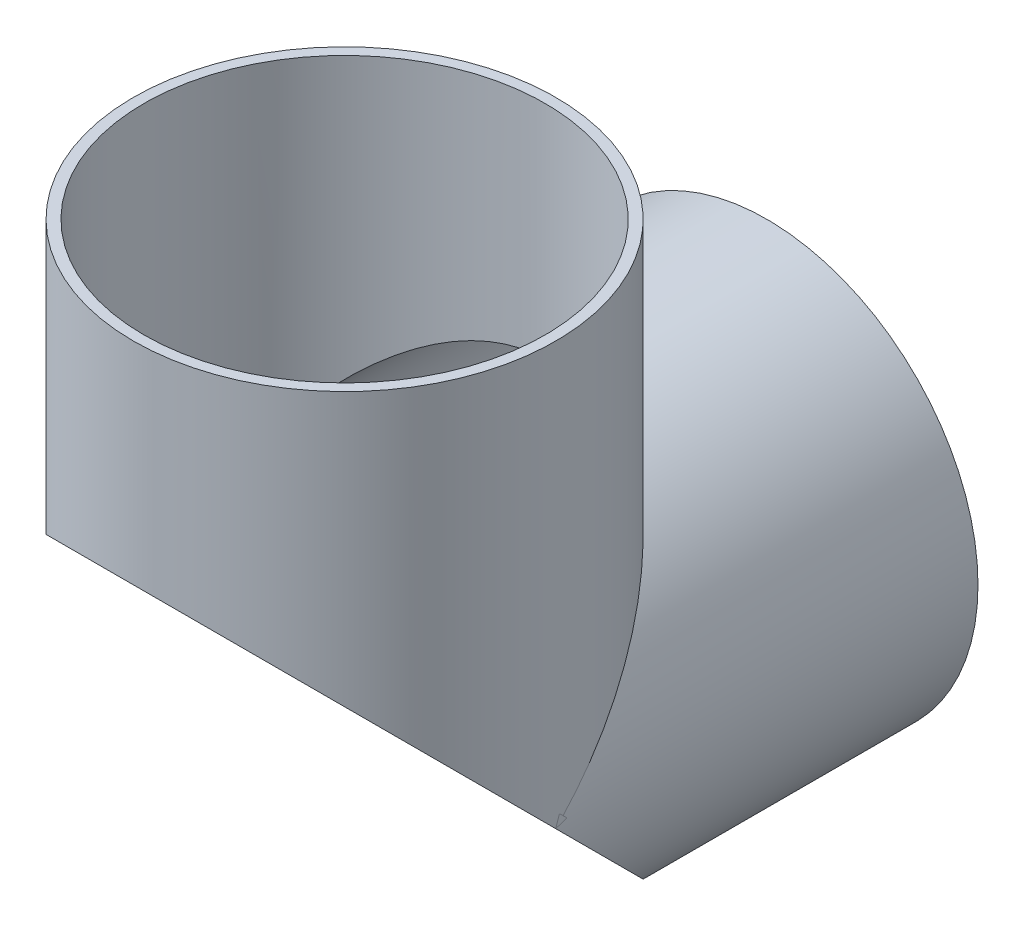
ISO-10303-21;
HEADER;
FILE_DESCRIPTION(('STEP AP214'),'2;1');
FILE_NAME('part.step','',(''),(''),'','','');
FILE_SCHEMA(('AUTOMOTIVE_DESIGN { 1 0 10303 214 1 1 1 1 }'));
ENDSEC;
DATA;
#1=APPLICATION_CONTEXT('core data for automotive mechanical design processes');
#2=APPLICATION_PROTOCOL_DEFINITION('international standard','automotive_design',2000,#1);
#3=PRODUCT_CONTEXT('',#1,'mechanical');
#4=PRODUCT('Part','Part','',(#3));
#5=PRODUCT_RELATED_PRODUCT_CATEGORY('part','',(#4));
#6=PRODUCT_DEFINITION_FORMATION('','',#4);
#7=PRODUCT_DEFINITION_CONTEXT('part definition',#1,'design');
#8=PRODUCT_DEFINITION('design','',#6,#7);
#9=PRODUCT_DEFINITION_SHAPE('','',#8);
#10=(LENGTH_UNIT() NAMED_UNIT(*) SI_UNIT(.MILLI.,.METRE.));
#11=(NAMED_UNIT(*) PLANE_ANGLE_UNIT() SI_UNIT($,.RADIAN.));
#12=(NAMED_UNIT(*) SI_UNIT($,.STERADIAN.) SOLID_ANGLE_UNIT());
#13=UNCERTAINTY_MEASURE_WITH_UNIT(LENGTH_MEASURE(1.E-05),#10,'distance_accuracy_value','');
#14=(GEOMETRIC_REPRESENTATION_CONTEXT(3) GLOBAL_UNCERTAINTY_ASSIGNED_CONTEXT((#13)) GLOBAL_UNIT_ASSIGNED_CONTEXT((#10,
#11,#12)) REPRESENTATION_CONTEXT('',''));
#15=CARTESIAN_POINT('',(0.,0.,0.));
#16=DIRECTION('',(0.,0.,1.));
#17=DIRECTION('',(1.,0.,0.));
#18=AXIS2_PLACEMENT_3D('',#15,#16,#17);
#19=CARTESIAN_POINT('',(0.,-1.11022302462516E-13,200.));
#20=DIRECTION('',(0.,0.707106781186547,-0.707106781186548));
#21=DIRECTION('',(0.,0.707106781186548,0.707106781186547));
#22=AXIS2_PLACEMENT_3D('',#19,#20,#21);
#23=PLANE('',#22);
#24=CARTESIAN_POINT('',(0.,0.,200.));
#25=DIRECTION('',(0.,0.707106781186547,-0.707106781186547));
#26=DIRECTION('',(0.,-0.707106781186547,-0.707106781186547));
#27=AXIS2_PLACEMENT_3D('',#24,#25,#26);
#28=ELLIPSE('',#27,141.42135623731,100.);
#29=CARTESIAN_POINT('',(-100.,1.82567841077825E-12,200.000000000002));
#30=VERTEX_POINT('',#29);
#31=CARTESIAN_POINT('',(100.,0.,200.));
#32=VERTEX_POINT('',#31);
#33=EDGE_CURVE('E62',#30,#32,#28,.T.);
#34=ORIENTED_EDGE('',*,*,#33,.F.);
#35=CARTESIAN_POINT('',(0.,0.,200.));
#36=DIRECTION('',(0.,-0.707106781186547,0.707106781186548));
#37=DIRECTION('',(0.,-0.707106781186548,-0.707106781186547));
#38=AXIS2_PLACEMENT_3D('',#35,#36,#37);
#39=ELLIPSE('',#38,141.421356237309,100.);
#40=EDGE_CURVE('E69',#30,#32,#39,.T.);
#41=ORIENTED_EDGE('',*,*,#40,.T.);
#42=EDGE_LOOP('',(#34,#41));
#43=FACE_BOUND('',#42,.T.);
#44=ADVANCED_FACE('F42',(#43),#23,.F.);
#45=CARTESIAN_POINT('',(0.,0.,300.));
#46=DIRECTION('',(0.,0.,-1.));
#47=DIRECTION('',(-1.,0.,0.));
#48=AXIS2_PLACEMENT_3D('',#45,#46,#47);
#49=CYLINDRICAL_SURFACE('',#48,100.);
#50=CARTESIAN_POINT('',(0.,0.,0.));
#51=DIRECTION('',(0.,0.,1.));
#52=DIRECTION('',(1.,0.,0.));
#53=AXIS2_PLACEMENT_3D('',#50,#51,#52);
#54=CIRCLE('',#53,100.);
#55=CARTESIAN_POINT('',(100.,0.,0.));
#56=VERTEX_POINT('',#55);
#57=EDGE_CURVE('E124',#56,#56,#54,.T.);
#58=ORIENTED_EDGE('',*,*,#57,.T.);
#59=EDGE_LOOP('',(#58));
#60=FACE_BOUND('',#59,.T.);
#61=ORIENTED_EDGE('',*,*,#40,.F.);
#62=CARTESIAN_POINT('',(-100.,-1.7343848482814E-13,199.999999999999));
#63=CARTESIAN_POINT('',(-99.9999999999833,0.0118915391122889,199.964673726303));
#64=CARTESIAN_POINT('',(-99.9999978788551,0.0237830782543081,199.929347452515));
#65=CARTESIAN_POINT('',(-99.9999591831496,0.132251892634134,199.60711842995));
#66=CARTESIAN_POINT('',(-99.9997848229157,0.228829165088495,199.320215689251));
#67=CARTESIAN_POINT('',(-99.9982134662523,0.711715938259225,197.885700765226));
#68=CARTESIAN_POINT('',(-99.9947178022097,1.0980248147733,196.738090436615));
#69=CARTESIAN_POINT('',(-99.9775137564245,2.25695959473605,193.295235238043));
#70=CARTESIAN_POINT('',(-99.957088178979,3.0295766133805,191.000016761998));
#71=CARTESIAN_POINT('',(-99.8982948870235,4.57475501661031,186.409745082534));
#72=CARTESIAN_POINT('',(-99.859926794793,5.347316399682,184.114691883613));
#73=CARTESIAN_POINT('',(-99.7177867687854,7.66563784107617,177.227639078725));
#74=CARTESIAN_POINT('',(-99.5869908028377,9.21123901037178,172.636111485393));
#75=CARTESIAN_POINT('',(-99.2526306804658,12.3016624298027,163.455370239052));
#76=CARTESIAN_POINT('',(-99.049065227961,13.8464846655737,158.866156628713));
#77=CARTESIAN_POINT('',(-98.567979025885,16.9350653342862,149.690889654115));
#78=CARTESIAN_POINT('',(-98.2904532853104,18.4788236883832,145.104836524078));
#79=CARTESIAN_POINT('',(-97.6598238479092,21.564763706029,135.937414149023));
#80=CARTESIAN_POINT('',(-97.3067205184413,23.1069453772051,131.356044881347));
#81=CARTESIAN_POINT('',(-96.5227436929072,26.1894926645148,122.198701312692));
#82=CARTESIAN_POINT('',(-96.091860539231,27.7298580311921,117.622727752775));
#83=CARTESIAN_POINT('',(-95.1496318456839,30.8080919704198,108.478197875732));
#84=CARTESIAN_POINT('',(-94.6382861134725,32.345960536993,103.909641576362));
#85=CARTESIAN_POINT('',(-93.5317409020801,35.4186388713055,94.7816157715021));
#86=CARTESIAN_POINT('',(-92.9365409037274,36.953448620047,90.2221463224501));
#87=CARTESIAN_POINT('',(-91.6581202425339,40.0193457705283,81.1142654251485));
#88=CARTESIAN_POINT('',(-90.974899847349,41.5504331835726,76.5658539433163));
#89=CARTESIAN_POINT('',(-89.7583457133371,44.0989271005332,68.9950262462646));
#90=CARTESIAN_POINT('',(-89.2508694303892,45.1175951853389,65.9688622443715));
#91=CARTESIAN_POINT('',(-88.1926474685648,47.1526508885294,59.9233088372314));
#92=CARTESIAN_POINT('',(-87.6419016398468,48.1690384990043,56.903919455482));
#93=CARTESIAN_POINT('',(-86.4950681501336,50.1992274832938,50.8728236422976));
#94=CARTESIAN_POINT('',(-85.8989797174011,51.2130288127857,47.8611173425318));
#95=CARTESIAN_POINT('',(-84.6590460639588,53.2377243754063,41.8463408733502));
#96=CARTESIAN_POINT('',(-84.0151978987074,54.2486184252939,38.8432712482898));
#97=CARTESIAN_POINT('',(-82.6770322036411,56.2669932479182,32.8472718431298));
#98=CARTESIAN_POINT('',(-81.9827152884284,57.2744740620647,29.8543419400144));
#99=CARTESIAN_POINT('',(-80.5404359496793,59.28549038382,23.8802024819339));
#100=CARTESIAN_POINT('',(-79.792475425055,60.2890260297572,20.8989925160354));
#101=CARTESIAN_POINT('',(-78.290902406526,62.2248621111805,15.1481914940815));
#102=CARTESIAN_POINT('',(-77.5409864886276,63.1574540677576,12.3777344143927));
#103=CARTESIAN_POINT('',(-75.9876137009226,65.0180854234326,6.85034456747156));
#104=CARTESIAN_POINT('',(-75.184157473958,65.9461248770475,4.09341163828551));
#105=CARTESIAN_POINT('',(-73.5200636266441,67.7963688458683,-1.40312032999216));
#106=CARTESIAN_POINT('',(-72.6594612722748,68.718576582044,-4.14272893764015));
#107=CARTESIAN_POINT('',(-70.875763944533,70.5568308736887,-9.60364309276668));
#108=CARTESIAN_POINT('',(-69.9526689491666,71.472877426989,-12.3249486338032));
#109=CARTESIAN_POINT('',(-68.0378887740658,73.2979966459571,-17.7468423418611));
#110=CARTESIAN_POINT('',(-67.0461823990658,74.207067059357,-20.4474238180556));
#111=CARTESIAN_POINT('',(-65.5021425599706,75.5641329892732,-24.4788685315599));
#112=CARTESIAN_POINT('',(-64.9780353380064,76.0154096219416,-25.8194790022763));
#113=CARTESIAN_POINT('',(-63.9099687046666,76.915563087617,-28.493570843022));
#114=CARTESIAN_POINT('',(-63.3660095635358,77.364439953197,-29.8270523098156));
#115=CARTESIAN_POINT('',(-62.2558206694959,78.2606087105864,-32.4893067513586));
#116=CARTESIAN_POINT('',(-61.689541382341,78.7078943608088,-33.8180611841839));
#117=CARTESIAN_POINT('',(-60.5346888164108,79.5995203496951,-36.4668203933577));
#118=CARTESIAN_POINT('',(-59.9461159365613,80.043860740895,-37.7868253257753));
#119=CARTESIAN_POINT('',(-58.7453000987124,80.9292667044664,-40.4171066646974));
#120=CARTESIAN_POINT('',(-58.1330576471057,81.3703323466584,-41.7273832786179));
#121=CARTESIAN_POINT('',(-56.8833661411814,82.2488054672208,-44.3370691750628));
#122=CARTESIAN_POINT('',(-56.2459176402826,82.6862130256522,-45.6364786954248));
#123=CARTESIAN_POINT('',(-54.8630681563,83.6111195255857,-48.3841045383935));
#124=CARTESIAN_POINT('',(-54.1141052652703,84.0980777396284,-49.830714518367));
#125=CARTESIAN_POINT('',(-52.5793142854262,85.0660857956364,-52.7063824383957));
#126=CARTESIAN_POINT('',(-51.793484340614,85.5471353386,-54.1354394902044));
#127=CARTESIAN_POINT('',(-50.1816721199759,86.5024722311601,-56.9734651013605));
#128=CARTESIAN_POINT('',(-49.3556821473427,86.9767582618006,-58.3824297424766));
#129=CARTESIAN_POINT('',(-47.6595881528471,87.9176022219034,-61.1774011035404));
#130=CARTESIAN_POINT('',(-46.7894600773976,88.3841557496624,-62.5633947473187));
#131=CARTESIAN_POINT('',(-45.0049969217877,89.3059612531586,-65.3018084397033));
#132=CARTESIAN_POINT('',(-44.0908572830911,89.7612516592423,-66.6543426535932));
#133=CARTESIAN_POINT('',(-42.2103820280495,90.6607428239989,-69.3264669926283));
#134=CARTESIAN_POINT('',(-41.2440500737347,91.1049443575239,-70.6460594196315));
#135=CARTESIAN_POINT('',(-39.7517112623661,91.7610812885426,-72.595249730565));
#136=CARTESIAN_POINT('',(-39.247291699608,91.9780321372462,-73.2397470485031));
#137=CARTESIAN_POINT('',(-38.2233124846292,92.4082620587223,-74.5178339153913));
#138=CARTESIAN_POINT('',(-37.7037533592084,92.6215412588445,-75.15142384266));
#139=CARTESIAN_POINT('',(-36.6490166480684,93.0439256227826,-76.4062038599957));
#140=CARTESIAN_POINT('',(-36.1138487458066,93.2530332444558,-77.0274012516357));
#141=CARTESIAN_POINT('',(-35.0267816174656,93.6667642932045,-78.2564748084337));
#142=CARTESIAN_POINT('',(-34.4748828089374,93.8713878319695,-78.8643513053882));
#143=CARTESIAN_POINT('',(-33.061603121278,94.3808886226103,-80.3779286664262));
#144=CARTESIAN_POINT('',(-32.1886409382836,94.6825182701136,-81.2739818507684));
#145=CARTESIAN_POINT('',(-30.3988191852552,95.2722390677525,-83.0258693159802));
#146=CARTESIAN_POINT('',(-29.4819610152131,95.5603306490831,-83.8817048778034));
#147=CARTESIAN_POINT('',(-27.5997518264022,96.1208579457224,-85.5468670169431));
#148=CARTESIAN_POINT('',(-26.6343345731337,96.3932711274121,-86.3561266534887));
#149=CARTESIAN_POINT('',(-24.6531453853031,96.9188971380846,-87.9176073120873));
#150=CARTESIAN_POINT('',(-23.6373726128803,97.1721096474119,-88.6698273845376));
#151=CARTESIAN_POINT('',(-21.5394410207843,97.6587290610163,-90.1154308878149));
#152=CARTESIAN_POINT('',(-20.4565841395181,97.8918312447749,-90.8079090833865));
#153=CARTESIAN_POINT('',(-18.2353509107448,98.3298142530036,-92.1090280962546));
#154=CARTESIAN_POINT('',(-17.0969692349153,98.5346923617654,-92.7176608459782));
#155=CARTESIAN_POINT('',(-15.3510101216336,98.8164616865762,-93.5547148386363));
#156=CARTESIAN_POINT('',(-14.7633492696309,98.9060352014636,-93.8208114704226));
#157=CARTESIAN_POINT('',(-13.5752789488783,99.0760906350332,-94.3259962691521));
#158=CARTESIAN_POINT('',(-12.9748714538615,99.1565739492498,-94.5650885818184));
#159=CARTESIAN_POINT('',(-11.7622217137345,99.3077206269972,-95.0141010148445));
#160=CARTESIAN_POINT('',(-11.1499830826764,99.378386936954,-95.2240298881716));
#161=CARTESIAN_POINT('',(-9.91467077354451,99.5092204144234,-95.6126977630818));
#162=CARTESIAN_POINT('',(-9.29159914962308,99.5693895490413,-95.7914426083579));
#163=CARTESIAN_POINT('',(-8.07179074522208,99.6754698231141,-96.1065759785877));
#164=CARTESIAN_POINT('',(-7.47558258422537,99.721999061381,-96.2448006937611));
#165=CARTESIAN_POINT('',(-6.27618075653445,99.8046633299756,-96.4903719819905));
#166=CARTESIAN_POINT('',(-5.67298794827883,99.8407996238208,-96.5977223085859));
#167=CARTESIAN_POINT('',(-4.46125151650037,99.9022783300207,-96.780357506802));
#168=CARTESIAN_POINT('',(-3.85270827445823,99.9276215056456,-96.8556446458748));
#169=CARTESIAN_POINT('',(-2.6323738184983,99.9672101192839,-96.9732508016618));
#170=CARTESIAN_POINT('',(-2.02058433578164,99.9814609706178,-97.0155858997632));
#171=CARTESIAN_POINT('',(-0.79540160632904,99.9987136047095,-97.0668384137126));
#172=CARTESIAN_POINT('',(-0.182008238592547,100.00171451272,-97.0757532309423));
#173=CARTESIAN_POINT('',(1.04430096744678,99.9964266067743,-97.0600444138542));
#174=CARTESIAN_POINT('',(1.6572168181473,99.9881380964081,-97.0354216814119));
#175=CARTESIAN_POINT('',(2.72714911508751,99.9638580888564,-96.9632929027503));
#176=CARTESIAN_POINT('',(3.18472933121801,99.95031852245,-96.9230708234769));
#177=CARTESIAN_POINT('',(4.09771071165408,99.9170526690965,-96.8242477333928));
#178=CARTESIAN_POINT('',(4.55311173327161,99.8973259825113,-96.7656455353745));
#179=CARTESIAN_POINT('',(5.46087907403801,99.8518166642512,-96.6304507032954));
#180=CARTESIAN_POINT('',(5.91324571630685,99.8260346882599,-96.5538600170785));
#181=CARTESIAN_POINT('',(6.81430118816465,99.7685783397866,-96.3831740635049));
#182=CARTESIAN_POINT('',(7.26298967621535,99.7369034264389,-96.2890771893948));
#183=CARTESIAN_POINT('',(8.60305725903937,99.6332770899068,-95.9812337476114));
#184=CARTESIAN_POINT('',(9.48804441943277,99.5527440733559,-95.741993783893));
#185=CARTESIAN_POINT('',(11.236373158162,99.3706042702267,-95.200909868766));
#186=CARTESIAN_POINT('',(12.099711794853,99.2689946369226,-94.8990574605706));
#187=CARTESIAN_POINT('',(13.5560987463693,99.0787822753626,-94.3339923428412));
#188=CARTESIAN_POINT('',(14.1552500732229,98.9948878826974,-94.0847667169174));
#189=CARTESIAN_POINT('',(15.3404808600124,98.8181598586597,-93.5597596096509));
#190=CARTESIAN_POINT('',(15.9265590836274,98.7253253862028,-93.2839756296932));
#191=CARTESIAN_POINT('',(17.6647529966837,98.4344290057773,-92.4198078326893));
#192=CARTESIAN_POINT('',(18.7966974251003,98.2239914552804,-91.7946596127157));
#193=CARTESIAN_POINT('',(21.007413748382,97.7750716665202,-90.4610506337492));
#194=CARTESIAN_POINT('',(22.0860612887382,97.5365278649253,-89.7524069881607));
#195=CARTESIAN_POINT('',(24.1891105660362,97.0363594288065,-88.2665533142876));
#196=CARTESIAN_POINT('',(25.2135144808518,96.7747357220637,-87.4893460421682));
#197=CARTESIAN_POINT('',(27.0991425857278,96.2625645091294,-85.967835640001));
#198=CARTESIAN_POINT('',(27.9658135474911,96.014043340747,-85.2295521650547));
#199=CARTESIAN_POINT('',(29.6611299804209,95.5039333083676,-83.7141649255641));
#200=CARTESIAN_POINT('',(30.4897584386076,95.242338704947,-82.937044110876));
#201=CARTESIAN_POINT('',(32.1113885777001,94.7079084452835,-81.3494086116991));
#202=CARTESIAN_POINT('',(32.9043710433106,94.4350668746323,-80.5388763572385));
#203=CARTESIAN_POINT('',(34.4566441198024,93.8798120813163,-78.8893772785156));
#204=CARTESIAN_POINT('',(35.2159340462224,93.5973986644056,-78.0504098772057));
#205=CARTESIAN_POINT('',(36.7045448927417,93.0237274481581,-76.3462010093472));
#206=CARTESIAN_POINT('',(37.4338040007386,92.7324533621334,-75.4809111598273));
#207=CARTESIAN_POINT('',(38.862611769474,92.1427936039175,-73.729205024832));
#208=CARTESIAN_POINT('',(39.5621729483074,91.8444110125493,-72.8427978915781));
#209=CARTESIAN_POINT('',(40.9338205289572,91.2413476747953,-71.0512736543963));
#210=CARTESIAN_POINT('',(41.605909958129,90.9366676279837,-70.1461586286981));
#211=CARTESIAN_POINT('',(42.9244909503339,90.3217427210469,-68.3193971496701));
#212=CARTESIAN_POINT('',(43.5709831698444,90.0114980039325,-67.3977511211838));
#213=CARTESIAN_POINT('',(44.928830287693,89.3423222366358,-65.4098262532674));
#214=CARTESIAN_POINT('',(45.6366055503406,88.9826523348968,-64.3413525026406));
#215=CARTESIAN_POINT('',(47.0233274343185,88.257683986387,-62.1876842455355));
#216=CARTESIAN_POINT('',(47.7022724513556,87.8923852279293,-61.1024888131268));
#217=CARTESIAN_POINT('',(49.0333316567463,87.1568161351158,-58.9173288549676));
#218=CARTESIAN_POINT('',(49.6854438309338,86.7865454303053,-57.8173632287049));
#219=CARTESIAN_POINT('',(50.9645546642266,86.0416287859581,-55.6044344375119));
#220=CARTESIAN_POINT('',(51.5915537263416,85.6669829167577,-54.4914714815302));
#221=CARTESIAN_POINT('',(52.8211569552892,84.9143344930754,-52.2555738424454));
#222=CARTESIAN_POINT('',(53.4237952045227,84.5363375990049,-51.1326559747635));
#223=CARTESIAN_POINT('',(54.6070723108799,83.7768575577342,-48.8764636042249));
#224=CARTESIAN_POINT('',(55.1877110863398,83.3953743975992,-47.7431890629427));
#225=CARTESIAN_POINT('',(56.3282559045404,82.6292897523018,-45.4673763516373));
#226=CARTESIAN_POINT('',(56.8881628735674,82.2446884073965,-44.3248385982766));
#227=CARTESIAN_POINT('',(57.9884383387714,81.4726487743931,-42.0313353656945));
#228=CARTESIAN_POINT('',(58.5288064790338,81.0852104347714,-40.8803697334118));
#229=CARTESIAN_POINT('',(60.1111371380059,79.9271506502145,-37.4401138892011));
#230=CARTESIAN_POINT('',(61.1261853080631,79.1527730928287,-35.1396653692272));
#231=CARTESIAN_POINT('',(63.0912130955687,77.5955536403196,-30.5136232653064));
#232=CARTESIAN_POINT('',(64.0411819640062,76.8127103715375,-28.1880256006224));
#233=CARTESIAN_POINT('',(65.8819662053753,75.239831763617,-23.5154647403848));
#234=CARTESIAN_POINT('',(66.7727710931513,74.4497951777253,-21.1684978410929));
#235=CARTESIAN_POINT('',(68.5000391347191,72.8637032297543,-16.4566840243698));
#236=CARTESIAN_POINT('',(69.3365016846909,72.0676478009068,-14.0918369085901));
#237=CARTESIAN_POINT('',(70.9603464474314,70.469345313156,-9.34374916076365));
#238=CARTESIAN_POINT('',(71.7476646830302,69.6670916507647,-6.96048891169191));
#239=CARTESIAN_POINT('',(73.2755890455757,68.0581997013367,-2.18094298017972));
#240=CARTESIAN_POINT('',(74.0162016763289,67.2515620418436,0.215340838012712));
#241=CARTESIAN_POINT('',(75.4539361215785,65.6343962332274,5.01946597761637));
#242=CARTESIAN_POINT('',(76.1510598637319,64.823868258261,7.42730678165876));
#243=CARTESIAN_POINT('',(77.5045601560665,63.1993735235859,12.2532040102688));
#244=CARTESIAN_POINT('',(78.1609372556731,62.3854068104031,14.6712602966217));
#245=CARTESIAN_POINT('',(79.432817333866,60.7576341273005,19.5068953482627));
#246=CARTESIAN_POINT('',(80.048470943309,59.9438401205751,21.9244385744099));
#247=CARTESIAN_POINT('',(81.2437733822365,58.3135567746308,26.7675320687179));
#248=CARTESIAN_POINT('',(81.8234217211758,57.497067398849,29.1930824454964));
#249=CARTESIAN_POINT('',(82.9485169860533,55.8616914804753,34.0513044783258));
#250=CARTESIAN_POINT('',(83.4939637126773,55.0428049239426,36.4839761757907));
#251=CARTESIAN_POINT('',(84.5522579108257,53.4028837781222,41.3557007457936));
#252=CARTESIAN_POINT('',(85.065105035504,52.5818491660767,43.794753685938));
#253=CARTESIAN_POINT('',(86.0592687612502,50.9384323885171,48.6768627522149));
#254=CARTESIAN_POINT('',(86.5406070064603,50.1160515543684,51.1199149232512));
#255=CARTESIAN_POINT('',(87.473406510755,48.4695614915038,56.0111538184662));
#256=CARTESIAN_POINT('',(87.9248675094335,47.6454522477879,58.4593405872056));
#257=CARTESIAN_POINT('',(88.7990260564082,45.9957002596873,63.3602697052443));
#258=CARTESIAN_POINT('',(89.2217241849448,45.170057546583,65.8130119616186));
#259=CARTESIAN_POINT('',(90.0393693965351,43.5173729493425,70.7226530009828));
#260=CARTESIAN_POINT('',(90.4343162914783,42.6903310557609,73.1795518120322));
#261=CARTESIAN_POINT('',(91.5471783264006,40.2761385040233,80.3514095571373));
#262=CARTESIAN_POINT('',(92.2292159436746,38.6872920465886,85.0714062133022));
#263=CARTESIAN_POINT('',(93.5001024415841,35.5058362885166,94.522577828765));
#264=CARTESIAN_POINT('',(94.0889514815496,33.9132269943175,99.2537527689366));
#265=CARTESIAN_POINT('',(95.1779177264776,30.7246273967314,108.726146635586));
#266=CARTESIAN_POINT('',(95.6780183924014,29.1286365191186,113.46736726792));
#267=CARTESIAN_POINT('',(96.5928506126748,25.9341724541942,122.957182746394));
#268=CARTESIAN_POINT('',(97.007581976793,24.3356992613593,127.705777608943));
#269=CARTESIAN_POINT('',(97.8219059218379,20.847913053503,138.066967113097));
#270=CARTESIAN_POINT('',(98.2052364432343,18.9582124249861,143.680713240668));
#271=CARTESIAN_POINT('',(98.8602335972496,15.1768211580159,154.914117231525));
#272=CARTESIAN_POINT('',(99.1318984435192,13.2851304882125,160.533775187943));
#273=CARTESIAN_POINT('',(99.5658697574477,9.50076234122323,171.776022615743));
#274=CARTESIAN_POINT('',(99.7281924170401,7.60808505170229,177.398611529628));
#275=CARTESIAN_POINT('',(99.9449147987892,3.8221491886573,188.645516182514));
#276=CARTESIAN_POINT('',(99.9993184650482,1.92889063890586,194.269831850893));
#277=CARTESIAN_POINT('',(99.9999978774503,0.023783076521767,199.929347457641));
#278=CARTESIAN_POINT('',(99.9999999985621,0.0118915373764817,199.964673731448));
#279=CARTESIAN_POINT('',(100.,1.7343848482814E-13,200.));
#280=B_SPLINE_CURVE_WITH_KNOTS('',3,(#62,#63,#64,#65,#66,#67,#68,#69,#70,#71,#72,#73,#74,#75,
#76,#77,#78,#79,#80,#81,#82,#83,#84,#85,#86,#87,#88,#89,#90,#91,#92,#93,#94,#95,#96,#97,#98,#99,
#100,#101,#102,#103,#104,#105,#106,#107,#108,#109,#110,#111,#112,#113,#114,#115,#116,#117,#118,
#119,#120,#121,#122,#123,#124,#125,#126,#127,#128,#129,#130,#131,#132,#133,#134,#135,#136,#137,
#138,#139,#140,#141,#142,#143,#144,#145,#146,#147,#148,#149,#150,#151,#152,#153,#154,#155,#156,
#157,#158,#159,#160,#161,#162,#163,#164,#165,#166,#167,#168,#169,#170,#171,#172,#173,#174,#175,
#176,#177,#178,#179,#180,#181,#182,#183,#184,#185,#186,#187,#188,#189,#190,#191,#192,#193,#194,
#195,#196,#197,#198,#199,#200,#201,#202,#203,#204,#205,#206,#207,#208,#209,#210,#211,#212,#213,
#214,#215,#216,#217,#218,#219,#220,#221,#222,#223,#224,#225,#226,#227,#228,#229,#230,#231,#232,
#233,#234,#235,#236,#237,#238,#239,#240,#241,#242,#243,#244,#245,#246,#247,#248,#249,#250,#251,
#252,#253,#254,#255,#256,#257,#258,#259,#260,#261,#262,#263,#264,#265,#266,#267,#268,#269,#270,
#271,#272,#273,#274,#275,#276,#277,#278,#279),.UNSPECIFIED.,.F.,.F.,(4,2,2,2,2,2,2,2,2,2,2,2,2,
2,2,2,2,2,2,2,2,2,2,2,2,2,2,2,2,2,2,2,2,2,2,2,2,2,2,2,2,2,2,2,2,2,2,2,2,2,2,2,2,2,2,2,2,2,2,2,2,
2,2,2,2,2,2,2,2,2,2,2,2,2,2,2,2,2,2,2,2,2,2,2,2,2,2,2,2,2,2,2,2,2,2,2,2,2,2,2,2,2,2,2,2,2,2,2,
4),(0.,0.111822130616854,1.01998688548926,4.65265172542728,11.9181415927663,19.1837844179349,
33.7225563083776,48.2615871584188,62.8015993828741,77.3415409345254,91.8832890960026,
106.425072019078,120.966944979448,135.508773721338,145.207788162096,154.906836191826,
164.606049337645,174.30586096904,184.005554497106,193.704904838288,202.758045302294,
211.811077087602,220.858573080967,229.90607225854,238.956378956604,243.481760012736,
248.007079487655,252.543079919305,257.078999221215,261.614821534183,266.150544314796,
271.250746916695,276.351206554157,281.452647595372,286.556899237463,291.640266611594,
296.72327777768,299.263171920048,301.802977788961,304.341240179366,306.879439274755,
310.738613452278,314.597664629536,318.462130373659,322.326660439837,326.242080713398,
330.157877464272,332.111124662146,334.064071587301,336.016431092585,337.968424343933,
339.808920896779,341.649193597436,343.489336135631,345.328580076044,347.167967025241,
349.00730451151,350.385542572975,351.763869675847,353.142047598359,354.520352075293,
357.278154514221,360.036329680194,361.998551932157,363.960958971049,367.886195485981,
371.820195438811,375.754037322152,379.248527269142,382.744565059363,386.242465358572,
389.740436684842,393.245280592314,396.748632184832,400.251596665419,403.754471249158,
407.747421301591,411.74059325607,415.734064407114,419.727471446131,423.715083079988,
427.70270951475,431.690157568938,435.677678220957,443.569442061519,451.462506241018,
459.356965532573,467.251512527686,475.156131230846,483.05964676554,490.962811725421,
498.865870096319,506.737839962333,514.609917054582,522.482040018051,530.354246723604,
538.220987827808,546.087797488417,553.954448402875,561.821152635953,576.900309356266,
591.979440294564,607.061378416976,622.143350146597,639.949214465181,657.755363618451,
675.558875368788,693.361736444373,693.47355857499),.UNSPECIFIED.);
#281=CARTESIAN_POINT('',(-99.9841423492317,1.78080843754961,194.709740625685));
#282=VERTEX_POINT('',#281);
#283=EDGE_CURVE('E179',#30,#282,#280,.T.);
#284=ORIENTED_EDGE('',*,*,#283,.T.);
#285=CARTESIAN_POINT('',(0.,0.,192.928932188135));
#286=DIRECTION('',(0.,0.707106781186547,-0.707106781186548));
#287=DIRECTION('',(0.,-0.707106781186548,-0.707106781186547));
#288=AXIS2_PLACEMENT_3D('',#285,#286,#287);
#289=ELLIPSE('',#288,141.421356237309,100.);
#290=CARTESIAN_POINT('',(-99.9374804565334,3.53553390593255,196.464466094067));
#291=VERTEX_POINT('',#290);
#292=EDGE_CURVE('E178',#291,#282,#289,.F.);
#293=ORIENTED_EDGE('',*,*,#292,.F.);
#294=CARTESIAN_POINT('',(0.,0.,200.));
#295=DIRECTION('',(0.,-0.707106781186547,-0.707106781186547));
#296=DIRECTION('',(0.,0.707106781186547,-0.707106781186547));
#297=AXIS2_PLACEMENT_3D('',#294,#295,#296);
#298=ELLIPSE('',#297,141.42135623731,100.);
#299=CARTESIAN_POINT('',(99.9374804565334,3.53553390593273,196.464466094067));
#300=VERTEX_POINT('',#299);
#301=EDGE_CURVE('E218',#300,#291,#298,.F.);
#302=ORIENTED_EDGE('',*,*,#301,.F.);
#303=CARTESIAN_POINT('',(99.9841423492317,1.7808084375498,194.709740625684));
#304=VERTEX_POINT('',#303);
#305=EDGE_CURVE('E152',#304,#300,#289,.F.);
#306=ORIENTED_EDGE('',*,*,#305,.F.);
#307=EDGE_CURVE('E173',#304,#32,#280,.T.);
#308=ORIENTED_EDGE('',*,*,#307,.T.);
#309=EDGE_LOOP('',(#61,#284,#293,#302,#306,#308));
#310=FACE_BOUND('',#309,.T.);
#311=ADVANCED_FACE('F160',(#60,#310),#49,.T.);
#312=CARTESIAN_POINT('',(0.,200.,200.));
#313=DIRECTION('',(0.,-1.,0.));
#314=DIRECTION('',(0.,0.,-1.));
#315=AXIS2_PLACEMENT_3D('',#312,#313,#314);
#316=CYLINDRICAL_SURFACE('',#315,100.);
#317=CARTESIAN_POINT('',(0.,200.,200.));
#318=DIRECTION('',(0.,1.,0.));
#319=DIRECTION('',(0.,0.,1.));
#320=AXIS2_PLACEMENT_3D('',#317,#318,#319);
#321=CIRCLE('',#320,100.);
#322=CARTESIAN_POINT('',(0.,200.,300.));
#323=VERTEX_POINT('',#322);
#324=EDGE_CURVE('E190',#323,#323,#321,.T.);
#325=ORIENTED_EDGE('',*,*,#324,.F.);
#326=EDGE_LOOP('',(#325));
#327=FACE_BOUND('',#326,.T.);
#328=ORIENTED_EDGE('',*,*,#33,.T.);
#329=CARTESIAN_POINT('',(100.,1.31731358492581E-13,200.));
#330=CARTESIAN_POINT('',(99.9999999999833,0.0353262736967522,199.988108460887));
#331=CARTESIAN_POINT('',(99.9999978788551,0.0706525474845111,199.976216921745));
#332=CARTESIAN_POINT('',(99.9999591831496,0.392881570050049,199.867748107366));
#333=CARTESIAN_POINT('',(99.9997848229157,0.679784310749004,199.771170834911));
#334=CARTESIAN_POINT('',(99.9982134662523,2.1142992347732,199.28828406174));
#335=CARTESIAN_POINT('',(99.9947178022097,3.26190956338444,198.901975185226));
#336=CARTESIAN_POINT('',(99.9775137564245,6.70476476195682,197.743040405265));
#337=CARTESIAN_POINT('',(99.957088178979,8.99998323800203,196.97042338662));
#338=CARTESIAN_POINT('',(99.8982948870235,13.5902549174648,195.42524498339));
#339=CARTESIAN_POINT('',(99.859926794793,15.8853081163856,194.652683600318));
#340=CARTESIAN_POINT('',(99.7177867687854,22.7723609212743,192.334362158924));
#341=CARTESIAN_POINT('',(99.5869908028377,27.3638885146054,190.788760989628));
#342=CARTESIAN_POINT('',(99.2526306804658,36.5446297609466,187.698337570198));
#343=CARTESIAN_POINT('',(99.049065227961,41.133843371285,186.153515334427));
#344=CARTESIAN_POINT('',(98.567979025885,50.3091103458834,183.064934665714));
#345=CARTESIAN_POINT('',(98.2904532853105,54.89516347592,181.521176311617));
#346=CARTESIAN_POINT('',(97.6598238479092,64.0625858509747,178.435236293971));
#347=CARTESIAN_POINT('',(97.3067205184413,68.6439551186509,176.893054622795));
#348=CARTESIAN_POINT('',(96.5227436929073,77.8012986873054,173.810507335486));
#349=CARTESIAN_POINT('',(96.0918605392312,82.3772722472217,172.270141968808));
#350=CARTESIAN_POINT('',(95.1496318456841,91.5218021242649,169.191908029581));
#351=CARTESIAN_POINT('',(94.6382861134728,96.090358423635,167.654039463008));
#352=CARTESIAN_POINT('',(93.5317409020804,105.218384228494,164.581361128695));
#353=CARTESIAN_POINT('',(92.9365409037278,109.777853677546,163.046551379954));
#354=CARTESIAN_POINT('',(91.6581202425343,118.885734574847,159.980654229473));
#355=CARTESIAN_POINT('',(90.9748998473493,123.434146056679,158.449566816428));
#356=CARTESIAN_POINT('',(89.7583457133376,131.004973753731,155.901072899468));
#357=CARTESIAN_POINT('',(89.2508694303897,134.031137755624,154.882404814662));
#358=CARTESIAN_POINT('',(88.1926474685654,140.076691162764,152.847349111472));
#359=CARTESIAN_POINT('',(87.6419016398473,143.096080544513,151.830961500997));
#360=CARTESIAN_POINT('',(86.4950681501343,149.127176357697,149.800772516707));
#361=CARTESIAN_POINT('',(85.8989797174019,152.138882657463,148.786971187215));
#362=CARTESIAN_POINT('',(84.6590460639596,158.153659126644,146.762275624595));
#363=CARTESIAN_POINT('',(84.0151978987083,161.156728751705,145.751381574707));
#364=CARTESIAN_POINT('',(82.677032203642,167.152728156865,143.733006752083));
#365=CARTESIAN_POINT('',(81.9827152884294,170.14565805998,142.725525937937));
#366=CARTESIAN_POINT('',(80.5404359496804,176.11979751806,140.714509616181));
#367=CARTESIAN_POINT('',(79.7924754250561,179.101007483959,139.710973970244));
#368=CARTESIAN_POINT('',(78.2909024065271,184.851808505913,137.775137888821));
#369=CARTESIAN_POINT('',(77.5409864886286,187.622265585602,136.842545932244));
#370=CARTESIAN_POINT('',(75.9876137009234,193.149655432524,134.981914576568));
#371=CARTESIAN_POINT('',(75.1841574739586,195.906588361711,134.053875122953));
#372=CARTESIAN_POINT('',(73.5200636266444,201.40312032999,132.203631154132));
#373=CARTESIAN_POINT('',(72.659461272275,204.142728937638,131.281423417956));
#374=CARTESIAN_POINT('',(70.8757639445328,209.603643092766,129.443169126311));
#375=CARTESIAN_POINT('',(69.9526689491663,212.324948633803,128.527122573011));
#376=CARTESIAN_POINT('',(68.0378887740652,217.746842341862,126.702003354042));
#377=CARTESIAN_POINT('',(67.046182399065,220.447423818057,125.792932940642));
#378=CARTESIAN_POINT('',(65.5021425599694,224.478868531562,124.435867010726));
#379=CARTESIAN_POINT('',(64.9780353380051,225.819479002278,123.984590378057));
#380=CARTESIAN_POINT('',(63.909968704665,228.493570843024,123.084436912382));
#381=CARTESIAN_POINT('',(63.3660095635341,229.827052309818,122.635560046802));
#382=CARTESIAN_POINT('',(62.255820669494,232.489306751362,121.739391289412));
#383=CARTESIAN_POINT('',(61.689541382339,233.818061184187,121.29210563919));
#384=CARTESIAN_POINT('',(60.5346888164086,236.466820393361,120.400479650303));
#385=CARTESIAN_POINT('',(59.9461159365589,237.786825325779,119.956139259103));
#386=CARTESIAN_POINT('',(58.7453000987097,240.417106664702,119.070733295532));
#387=CARTESIAN_POINT('',(58.1330576471029,241.727383278623,118.62966765334));
#388=CARTESIAN_POINT('',(56.8833661411783,244.337069175068,117.751194532777));
#389=CARTESIAN_POINT('',(56.2459176402794,245.63647869543,117.313786974346));
#390=CARTESIAN_POINT('',(54.8630681562965,248.384104538399,116.388880474412));
#391=CARTESIAN_POINT('',(54.1141052652667,249.830714518373,115.901922260369));
#392=CARTESIAN_POINT('',(52.5793142854224,252.706382438401,114.933914204361));
#393=CARTESIAN_POINT('',(51.7934843406101,254.13543949021,114.452864661398));
#394=CARTESIAN_POINT('',(50.1816721199718,256.973465101366,113.497527768837));
#395=CARTESIAN_POINT('',(49.3556821473384,258.382429742483,113.023241738197));
#396=CARTESIAN_POINT('',(47.6595881528426,261.177401103546,112.082397778094));
#397=CARTESIAN_POINT('',(46.7894600773929,262.563394747325,111.615844250335));
#398=CARTESIAN_POINT('',(45.0049969217828,265.301808439709,110.694038746839));
#399=CARTESIAN_POINT('',(44.0908572830861,266.654342653599,110.238748340755));
#400=CARTESIAN_POINT('',(42.2103820280442,269.326466992634,109.339257175999));
#401=CARTESIAN_POINT('',(41.2440500737292,270.646059419638,108.895055642474));
#402=CARTESIAN_POINT('',(39.7517112623604,272.595249730571,108.238918711455));
#403=CARTESIAN_POINT('',(39.2472916996022,273.239747048509,108.021967862751));
#404=CARTESIAN_POINT('',(38.2233124846233,274.517833915397,107.591737941275));
#405=CARTESIAN_POINT('',(37.7037533592023,275.151423842666,107.378458741153));
#406=CARTESIAN_POINT('',(36.6490166480622,276.406203860002,106.956074377215));
#407=CARTESIAN_POINT('',(36.1138487458003,277.027401251642,106.746966755542));
#408=CARTESIAN_POINT('',(35.0267816174591,278.25647480844,106.333235706793));
#409=CARTESIAN_POINT('',(34.4748828089308,278.864351305394,106.128612168028));
#410=CARTESIAN_POINT('',(33.0616031212714,280.377928666432,105.619111377388));
#411=CARTESIAN_POINT('',(32.1886409382771,281.273981850774,105.317481729884));
#412=CARTESIAN_POINT('',(30.3988191852489,283.025869315985,104.727760932245));
#413=CARTESIAN_POINT('',(29.4819610152069,283.881704877808,104.439669350915));
#414=CARTESIAN_POINT('',(27.5997518263962,285.546867016947,103.879142054276));
#415=CARTESIAN_POINT('',(26.6343345731279,286.356126653492,103.606728872586));
#416=CARTESIAN_POINT('',(24.6531453852974,287.917607312091,103.081102861914));
#417=CARTESIAN_POINT('',(23.6373726128748,288.669827384541,102.827890352587));
#418=CARTESIAN_POINT('',(21.539441020779,290.115430887817,102.341270938983));
#419=CARTESIAN_POINT('',(20.456584139513,290.807909083389,102.108168755224));
#420=CARTESIAN_POINT('',(18.23535091074,292.109028096256,101.670185746996));
#421=CARTESIAN_POINT('',(17.0969692349107,292.71766084598,101.465307638234));
#422=CARTESIAN_POINT('',(15.3510101216293,293.554714838637,101.183538313423));
#423=CARTESIAN_POINT('',(14.7633492696267,293.820811470424,101.093964798536));
#424=CARTESIAN_POINT('',(13.5752789488742,294.325996269153,100.923909364966));
#425=CARTESIAN_POINT('',(12.9748714538576,294.565088581819,100.84342605075));
#426=CARTESIAN_POINT('',(11.7622217137308,295.014101014845,100.692279373002));
#427=CARTESIAN_POINT('',(11.1499830826729,295.224029888172,100.621613063046));
#428=CARTESIAN_POINT('',(9.91467077354116,295.612697763082,100.490779585576));
#429=CARTESIAN_POINT('',(9.29159914961982,295.791442608358,100.430610450958));
#430=CARTESIAN_POINT('',(8.07179074521893,296.106575978588,100.324530176886));
#431=CARTESIAN_POINT('',(7.47558258422222,296.244800693761,100.278000938619));
#432=CARTESIAN_POINT('',(6.2761807565313,296.49037198199,100.195336670024));
#433=CARTESIAN_POINT('',(5.67298794827566,296.597722308586,100.159200376179));
#434=CARTESIAN_POINT('',(4.46125151649718,296.780357506802,100.097721669979));
#435=CARTESIAN_POINT('',(3.85270827445503,296.855644645874,100.072378494354));
#436=CARTESIAN_POINT('',(2.6323738184951,296.973250801661,100.032789880716));
#437=CARTESIAN_POINT('',(2.02058433577844,297.015585899763,100.018539029382));
#438=CARTESIAN_POINT('',(0.795401606325841,297.066838413712,100.00128639529));
#439=CARTESIAN_POINT('',(0.182008238589351,297.075753230942,99.9982854872801));
#440=CARTESIAN_POINT('',(-1.04430096744997,297.060044413853,100.003573393226));
#441=CARTESIAN_POINT('',(-1.65721681815048,297.035421681411,100.011861903592));
#442=CARTESIAN_POINT('',(-2.72714911509067,296.963292902749,100.036141911144));
#443=CARTESIAN_POINT('',(-3.18472933122117,296.923070823476,100.04968147755));
#444=CARTESIAN_POINT('',(-4.09771071165722,296.824247733392,100.082947330904));
#445=CARTESIAN_POINT('',(-4.55311173327473,296.765645535373,100.102674017489));
#446=CARTESIAN_POINT('',(-5.46087907404112,296.630450703294,100.148183335749));
#447=CARTESIAN_POINT('',(-5.91324571630996,296.553860017077,100.17396531174));
#448=CARTESIAN_POINT('',(-6.81430118816772,296.383174063504,100.231421660214));
#449=CARTESIAN_POINT('',(-7.26298967621839,296.289077189394,100.263096573561));
#450=CARTESIAN_POINT('',(-8.60305725904236,295.98123374761,100.366722910093));
#451=CARTESIAN_POINT('',(-9.48804441943575,295.741993783892,100.447255926644));
#452=CARTESIAN_POINT('',(-11.2363731581649,295.200909868765,100.629395729774));
#453=CARTESIAN_POINT('',(-12.0997117948559,294.899057460569,100.731005363078));
#454=CARTESIAN_POINT('',(-13.5560987463722,294.333992342839,100.921217724638));
#455=CARTESIAN_POINT('',(-14.1552500732258,294.084766716916,101.005112117303));
#456=CARTESIAN_POINT('',(-15.3404808600154,293.559759609649,101.181840141341));
#457=CARTESIAN_POINT('',(-15.9265590836304,293.283975629691,101.274674613798));
#458=CARTESIAN_POINT('',(-17.6647529966869,292.419807832687,101.565570994223));
#459=CARTESIAN_POINT('',(-18.7966974251035,291.794659612713,101.77600854472));
#460=CARTESIAN_POINT('',(-21.0074137483853,290.461050633747,102.22492833348));
#461=CARTESIAN_POINT('',(-22.0860612887416,289.752406988158,102.463472135075));
#462=CARTESIAN_POINT('',(-24.1891105660396,288.266553314285,102.963640571194));
#463=CARTESIAN_POINT('',(-25.2135144808552,287.489346042165,103.225264277937));
#464=CARTESIAN_POINT('',(-27.0991425857314,285.967835639998,103.737435490872));
#465=CARTESIAN_POINT('',(-27.9658135474947,285.229552165051,103.985956659254));
#466=CARTESIAN_POINT('',(-29.6611299804247,283.71416492556,104.496066691634));
#467=CARTESIAN_POINT('',(-30.4897584386114,282.937044110872,104.757661295054));
#468=CARTESIAN_POINT('',(-32.1113885777041,281.349408611695,105.292091554718));
#469=CARTESIAN_POINT('',(-32.9043710433147,280.538876357234,105.564933125369));
#470=CARTESIAN_POINT('',(-34.4566441198065,278.889377278511,106.120187918685));
#471=CARTESIAN_POINT('',(-35.2159340462266,278.050409877201,106.402601335596));
#472=CARTESIAN_POINT('',(-36.704544892746,276.346201009342,106.976272551844));
#473=CARTESIAN_POINT('',(-37.4338040007429,275.480911159822,107.267546637868));
#474=CARTESIAN_POINT('',(-38.8626117694785,273.729205024826,107.857206396084));
#475=CARTESIAN_POINT('',(-39.5621729483119,272.842797891572,108.155588987453));
#476=CARTESIAN_POINT('',(-40.9338205289618,271.05127365439,108.758652325207));
#477=CARTESIAN_POINT('',(-41.6059099581337,270.146158628692,109.063332372018));
#478=CARTESIAN_POINT('',(-42.9244909503387,268.319397149663,109.678257278955));
#479=CARTESIAN_POINT('',(-43.5709831698491,267.397751121177,109.98850199607));
#480=CARTESIAN_POINT('',(-44.9288302876978,265.40982625326,110.657677763367));
#481=CARTESIAN_POINT('',(-45.6366055503455,264.341352502633,111.017347665106));
#482=CARTESIAN_POINT('',(-47.0233274343235,262.187684245528,111.742316013616));
#483=CARTESIAN_POINT('',(-47.7022724513606,261.102488813119,112.107614772073));
#484=CARTESIAN_POINT('',(-49.0333316567515,258.917328854959,112.843183864887));
#485=CARTESIAN_POINT('',(-49.6854438309389,257.817363228696,113.213454569698));
#486=CARTESIAN_POINT('',(-50.9645546642318,255.604434437503,113.958371214045));
#487=CARTESIAN_POINT('',(-51.5915537263469,254.491471481521,114.333017083245));
#488=CARTESIAN_POINT('',(-52.8211569552946,252.255573842436,115.085665506928));
#489=CARTESIAN_POINT('',(-53.4237952045281,251.132655974753,115.463662400999));
#490=CARTESIAN_POINT('',(-54.6070723108853,248.876463604214,116.223142442269));
#491=CARTESIAN_POINT('',(-55.1877110863452,247.743189062932,116.604625602404));
#492=CARTESIAN_POINT('',(-56.3282559045459,245.467376351626,117.370710247702));
#493=CARTESIAN_POINT('',(-56.888162873573,244.324838598265,117.755311592607));
#494=CARTESIAN_POINT('',(-57.9884383387771,242.031335365683,118.527351225611));
#495=CARTESIAN_POINT('',(-58.5288064790395,240.8803697334,118.914789565233));
#496=CARTESIAN_POINT('',(-60.1111371380116,237.440113889188,120.07284934979));
#497=CARTESIAN_POINT('',(-61.1261853080689,235.139665369214,120.847226907176));
#498=CARTESIAN_POINT('',(-63.0912130955747,230.513623265292,122.404446359685));
#499=CARTESIAN_POINT('',(-64.0411819640122,228.188025600608,123.187289628467));
#500=CARTESIAN_POINT('',(-65.8819662053814,223.515464740369,124.760168236388));
#501=CARTESIAN_POINT('',(-66.7727710931575,221.168497841077,125.55020482228));
#502=CARTESIAN_POINT('',(-68.5000391347253,216.456684024353,127.136296770252));
#503=CARTESIAN_POINT('',(-69.3365016846972,214.091836908573,127.932352199099));
#504=CARTESIAN_POINT('',(-70.9603464474378,209.343749160745,129.53065468685));
#505=CARTESIAN_POINT('',(-71.7476646830366,206.960488911673,130.332908349242));
#506=CARTESIAN_POINT('',(-73.2755890455821,202.18094298016,131.94180029867));
#507=CARTESIAN_POINT('',(-74.0162016763354,199.784659161967,132.748437958163));
#508=CARTESIAN_POINT('',(-75.4539361215849,194.980534022362,134.36560376678));
#509=CARTESIAN_POINT('',(-76.1510598637383,192.572693218319,135.176131741747));
#510=CARTESIAN_POINT('',(-77.5045601560729,187.746795989708,136.800626476422));
#511=CARTESIAN_POINT('',(-78.1609372556796,185.328739703355,137.614593189605));
#512=CARTESIAN_POINT('',(-79.4328173338725,180.493104651713,139.242365872708));
#513=CARTESIAN_POINT('',(-80.0484709433155,178.075561425565,140.056159879434));
#514=CARTESIAN_POINT('',(-81.2437733822429,173.232467931256,141.686443225378));
#515=CARTESIAN_POINT('',(-81.8234217211823,170.806917554477,142.50293260116));
#516=CARTESIAN_POINT('',(-82.9485169860596,165.948695521647,144.138308519534));
#517=CARTESIAN_POINT('',(-83.4939637126836,163.516023824181,144.957195076067));
#518=CARTESIAN_POINT('',(-84.552257910832,158.644299254177,146.597116221888));
#519=CARTESIAN_POINT('',(-85.0651050355103,156.205246314033,147.418150833933));
#520=CARTESIAN_POINT('',(-86.0592687612564,151.323137247755,149.061567611493));
#521=CARTESIAN_POINT('',(-86.5406070064665,148.880085076718,149.883948445642));
#522=CARTESIAN_POINT('',(-87.4734065107611,143.988846181502,151.530438508507));
#523=CARTESIAN_POINT('',(-87.9248675094396,141.540659412762,152.354547752223));
#524=CARTESIAN_POINT('',(-88.7990260564141,136.639730294722,154.004299740324));
#525=CARTESIAN_POINT('',(-89.2217241849507,134.186988038348,154.829942453429));
#526=CARTESIAN_POINT('',(-90.0393693965409,129.277346998982,156.48262705067));
#527=CARTESIAN_POINT('',(-90.4343162914841,126.820448187932,157.309668944251));
#528=CARTESIAN_POINT('',(-91.5471783264058,119.648590442828,159.723861495989));
#529=CARTESIAN_POINT('',(-92.2292159436794,114.928593786664,161.312707953423));
#530=CARTESIAN_POINT('',(-93.5001024415882,105.477422171204,164.494163711494));
#531=CARTESIAN_POINT('',(-94.0889514815534,100.746247231033,166.086773005693));
#532=CARTESIAN_POINT('',(-95.1779177264807,91.2738533643862,169.275372603278));
#533=CARTESIAN_POINT('',(-95.6780183924042,86.5326327320533,170.87136348089));
#534=CARTESIAN_POINT('',(-96.592850612677,77.0428172535817,174.065827545815));
#535=CARTESIAN_POINT('',(-97.007581976795,72.2942223910347,175.664300738652));
#536=CARTESIAN_POINT('',(-97.8219059218394,61.933032886882,179.152086946501));
#537=CARTESIAN_POINT('',(-98.2052364432355,56.3192867593094,181.041787575007));
#538=CARTESIAN_POINT('',(-98.8602335972504,45.0858827684648,184.823178842003));
#539=CARTESIAN_POINT('',(-99.1318984435198,39.4662248120613,186.714869511843));
#540=CARTESIAN_POINT('',(-99.565869757448,28.2239773842303,190.499237658728));
#541=CARTESIAN_POINT('',(-99.7281924170403,22.6013884703002,192.391914948108));
#542=CARTESIAN_POINT('',(-99.9449147987893,11.3544838175477,196.177850811537));
#543=CARTESIAN_POINT('',(-99.9993184650482,5.73016814934674,198.071109361813));
#544=CARTESIAN_POINT('',(-99.9999978774503,0.0706525423620172,199.976216923488));
#545=CARTESIAN_POINT('',(-99.9999999985621,0.0353262685533464,199.988108462628));
#546=CARTESIAN_POINT('',(-100.,-1.63314985423901E-13,200.));
#547=B_SPLINE_CURVE_WITH_KNOTS('',3,(#329,#330,#331,#332,#333,#334,#335,#336,#337,#338,#339,
#340,#341,#342,#343,#344,#345,#346,#347,#348,#349,#350,#351,#352,#353,#354,#355,#356,#357,#358,
#359,#360,#361,#362,#363,#364,#365,#366,#367,#368,#369,#370,#371,#372,#373,#374,#375,#376,#377,
#378,#379,#380,#381,#382,#383,#384,#385,#386,#387,#388,#389,#390,#391,#392,#393,#394,#395,#396,
#397,#398,#399,#400,#401,#402,#403,#404,#405,#406,#407,#408,#409,#410,#411,#412,#413,#414,#415,
#416,#417,#418,#419,#420,#421,#422,#423,#424,#425,#426,#427,#428,#429,#430,#431,#432,#433,#434,
#435,#436,#437,#438,#439,#440,#441,#442,#443,#444,#445,#446,#447,#448,#449,#450,#451,#452,#453,
#454,#455,#456,#457,#458,#459,#460,#461,#462,#463,#464,#465,#466,#467,#468,#469,#470,#471,#472,
#473,#474,#475,#476,#477,#478,#479,#480,#481,#482,#483,#484,#485,#486,#487,#488,#489,#490,#491,
#492,#493,#494,#495,#496,#497,#498,#499,#500,#501,#502,#503,#504,#505,#506,#507,#508,#509,#510,
#511,#512,#513,#514,#515,#516,#517,#518,#519,#520,#521,#522,#523,#524,#525,#526,#527,#528,#529,
#530,#531,#532,#533,#534,#535,#536,#537,#538,#539,#540,#541,#542,#543,#544,#545,#546),
.UNSPECIFIED.,.F.,.F.,(4,2,2,2,2,2,2,2,2,2,2,2,2,2,2,2,2,2,2,2,2,2,2,2,2,2,2,2,2,2,2,2,2,2,2,2,
2,2,2,2,2,2,2,2,2,2,2,2,2,2,2,2,2,2,2,2,2,2,2,2,2,2,2,2,2,2,2,2,2,2,2,2,2,2,2,2,2,2,2,2,2,2,2,2,
2,2,2,2,2,2,2,2,2,2,2,2,2,2,2,2,2,2,2,2,2,2,2,2,4),(0.,0.111822130616848,1.01998688548925,
4.65265172542713,11.9181415927659,19.1837844179343,33.7225563083766,48.2615871584173,
62.8015993828722,77.3415409345229,91.8832890959997,106.425072019075,120.966944979445,
135.508773721333,145.207788162091,154.906836191821,164.606049337639,174.305860969035,
184.0055544971,193.704904838282,202.75804530229,211.811077087599,220.858573080965,
229.906072258541,238.956378956606,243.481760012739,248.007079487658,252.54307991931,
257.07899922122,261.614821534189,266.150544314803,271.250746916703,276.351206554164,
281.45264759538,286.556899237471,291.640266611603,296.723277777688,299.263171920057,
301.80297778897,304.341240179375,306.879439274764,310.738613452287,314.597664629544,
318.462130373666,322.326660439843,326.242080713404,330.157877464276,332.11112466215,
334.064071587304,336.016431092588,337.968424343936,339.808920896782,341.649193597439,
343.489336135634,345.328580076046,347.167967025243,349.007304511513,350.385542572977,
351.76386967585,353.142047598361,354.520352075295,357.278154514223,360.036329680197,
361.99855193216,363.960958971052,367.886195485985,371.820195438814,375.754037322156,
379.248527269146,382.744565059368,386.242465358578,389.740436684848,393.24528059232,
396.748632184838,400.251596665426,403.754471249166,407.747421301599,411.740593256079,
415.734064407124,419.727471446142,423.715083079999,427.702709514762,431.69015756895,
435.67767822097,443.569442061533,451.462506241034,459.356965532591,467.251512527705,
475.156131230867,483.059646765562,490.962811725444,498.865870096344,506.73783996236,
514.60991705461,522.48204001808,530.354246723635,538.220987827841,546.087797488451,
553.95444840291,561.82115263599,576.900309356299,591.979440294594,607.061378417002,
622.143350146619,639.949214465197,657.755363618462,675.558875368793,693.361736444372,
693.473558574989),.UNSPECIFIED.);
#548=CARTESIAN_POINT('',(99.9841423492316,5.29025937514047,198.219191563275));
#549=VERTEX_POINT('',#548);
#550=EDGE_CURVE('E151',#32,#549,#547,.T.);
#551=ORIENTED_EDGE('',*,*,#550,.T.);
#552=CARTESIAN_POINT('',(0.,7.07106781186528,200.));
#553=DIRECTION('',(0.,0.707106781186547,-0.707106781186548));
#554=DIRECTION('',(0.,-0.707106781186548,-0.707106781186547));
#555=AXIS2_PLACEMENT_3D('',#552,#553,#554);
#556=ELLIPSE('',#555,141.42135623731,100.);
#557=EDGE_CURVE('E133',#300,#549,#556,.F.);
#558=ORIENTED_EDGE('',*,*,#557,.F.);
#559=ORIENTED_EDGE('',*,*,#301,.T.);
#560=CARTESIAN_POINT('',(-99.9841423492316,5.29025937514002,198.219191563275));
#561=VERTEX_POINT('',#560);
#562=EDGE_CURVE('E128',#561,#291,#556,.F.);
#563=ORIENTED_EDGE('',*,*,#562,.F.);
#564=EDGE_CURVE('E131',#561,#30,#547,.T.);
#565=ORIENTED_EDGE('',*,*,#564,.T.);
#566=EDGE_LOOP('',(#328,#551,#558,#559,#563,#565));
#567=FACE_BOUND('',#566,.T.);
#568=ADVANCED_FACE('F154',(#327,#567),#316,.T.);
#569=CARTESIAN_POINT('',(0.,0.,0.));
#570=DIRECTION('',(0.,0.,1.));
#571=DIRECTION('',(1.,0.,0.));
#572=AXIS2_PLACEMENT_3D('',#569,#570,#571);
#573=PLANE('',#572);
#574=ORIENTED_EDGE('',*,*,#57,.F.);
#575=EDGE_LOOP('',(#574));
#576=FACE_BOUND('',#575,.T.);
#577=CARTESIAN_POINT('',(0.,0.,0.));
#578=DIRECTION('',(0.,0.,1.));
#579=DIRECTION('',(1.,0.,0.));
#580=AXIS2_PLACEMENT_3D('',#577,#578,#579);
#581=CIRCLE('',#580,95.);
#582=CARTESIAN_POINT('',(95.,0.,0.));
#583=VERTEX_POINT('',#582);
#584=EDGE_CURVE('E236',#583,#583,#581,.T.);
#585=ORIENTED_EDGE('',*,*,#584,.T.);
#586=EDGE_LOOP('',(#585));
#587=FACE_BOUND('',#586,.T.);
#588=ADVANCED_FACE('F159',(#576,#587),#573,.F.);
#589=CARTESIAN_POINT('',(0.,200.,200.));
#590=DIRECTION('',(0.,1.,0.));
#591=DIRECTION('',(0.,0.,1.));
#592=AXIS2_PLACEMENT_3D('',#589,#590,#591);
#593=PLANE('',#592);
#594=CARTESIAN_POINT('',(0.,200.,200.));
#595=DIRECTION('',(0.,1.,0.));
#596=DIRECTION('',(0.,0.,1.));
#597=AXIS2_PLACEMENT_3D('',#594,#595,#596);
#598=CIRCLE('',#597,95.);
#599=CARTESIAN_POINT('',(0.,200.,295.));
#600=VERTEX_POINT('',#599);
#601=EDGE_CURVE('E217',#600,#600,#598,.T.);
#602=ORIENTED_EDGE('',*,*,#601,.F.);
#603=EDGE_LOOP('',(#602));
#604=FACE_BOUND('',#603,.T.);
#605=ORIENTED_EDGE('',*,*,#324,.T.);
#606=EDGE_LOOP('',(#605));
#607=FACE_BOUND('',#606,.T.);
#608=ADVANCED_FACE('F164',(#604,#607),#593,.T.);
#609=CARTESIAN_POINT('',(0.,0.,300.));
#610=DIRECTION('',(0.,0.,-1.));
#611=DIRECTION('',(-1.,0.,0.));
#612=AXIS2_PLACEMENT_3D('',#609,#610,#611);
#613=CYLINDRICAL_SURFACE('',#612,95.);
#614=ORIENTED_EDGE('',*,*,#584,.F.);
#615=EDGE_LOOP('',(#614));
#616=FACE_BOUND('',#615,.T.);
#617=CARTESIAN_POINT('',(0.,0.,200.));
#618=DIRECTION('',(0.,-0.707106781186547,-0.707106781186547));
#619=DIRECTION('',(0.,0.707106781186547,-0.707106781186547));
#620=AXIS2_PLACEMENT_3D('',#617,#618,#619);
#621=ELLIPSE('',#620,134.350288425444,95.);
#622=CARTESIAN_POINT('',(-94.9341877302376,3.53553390593254,196.464466094067));
#623=VERTEX_POINT('',#622);
#624=CARTESIAN_POINT('',(94.9341877302376,3.53553390593271,196.464466094067));
#625=VERTEX_POINT('',#624);
#626=EDGE_CURVE('E109',#623,#625,#621,.T.);
#627=ORIENTED_EDGE('',*,*,#626,.F.);
#628=CARTESIAN_POINT('',(0.,0.,192.928932188135));
#629=DIRECTION('',(0.,0.707106781186547,-0.707106781186548));
#630=DIRECTION('',(0.,-0.707106781186548,-0.707106781186547));
#631=AXIS2_PLACEMENT_3D('',#628,#629,#630);
#632=ELLIPSE('',#631,134.350288425444,95.);
#633=CARTESIAN_POINT('',(-0.778624367835118,-94.9968091258534,97.9321230622815));
#634=VERTEX_POINT('',#633);
#635=EDGE_CURVE('E120',#623,#634,#632,.F.);
#636=ORIENTED_EDGE('',*,*,#635,.T.);
#637=CARTESIAN_POINT('',(0.778624367848208,-94.9968091258533,97.9321230622816));
#638=CARTESIAN_POINT('',(3.27267837082409E-12,-95.0027830695186,97.9261491186162));
#639=CARTESIAN_POINT('',(-0.778624367841246,-94.9968091258533,97.9321230622816));
#640=B_SPLINE_CURVE_WITH_KNOTS('',2,(#637,#638,#639),.UNSPECIFIED.,.F.,.F.,(3,3),(0.,1.),.UNSPECIFIED.);
#641=CARTESIAN_POINT('',(0.778624367848189,-94.9968091258533,97.9321230622816));
#642=VERTEX_POINT('',#641);
#643=EDGE_CURVE('E127',#642,#634,#640,.T.);
#644=ORIENTED_EDGE('',*,*,#643,.F.);
#645=EDGE_CURVE('E116',#642,#625,#632,.F.);
#646=ORIENTED_EDGE('',*,*,#645,.T.);
#647=EDGE_LOOP('',(#627,#636,#644,#646));
#648=FACE_BOUND('',#647,.T.);
#649=ADVANCED_FACE('F119',(#616,#648),#613,.F.);
#650=CARTESIAN_POINT('',(0.,0.,200.));
#651=DIRECTION('',(0.,1.,0.));
#652=DIRECTION('',(0.,0.,1.));
#653=AXIS2_PLACEMENT_3D('',#650,#651,#652);
#654=CYLINDRICAL_SURFACE('',#653,95.);
#655=CARTESIAN_POINT('',(0.,7.07106781186527,200.));
#656=DIRECTION('',(0.,0.707106781186547,-0.707106781186548));
#657=DIRECTION('',(0.,0.707106781186548,0.707106781186547));
#658=AXIS2_PLACEMENT_3D('',#655,#656,#657);
#659=ELLIPSE('',#658,134.350288425444,95.);
#660=CARTESIAN_POINT('',(-0.778624368202635,102.067876937716,294.99680912585));
#661=VERTEX_POINT('',#660);
#662=EDGE_CURVE('E105',#623,#661,#659,.T.);
#663=ORIENTED_EDGE('',*,*,#662,.F.);
#664=ORIENTED_EDGE('',*,*,#626,.T.);
#665=CARTESIAN_POINT('',(0.77862436819364,102.067876937716,294.99680912585));
#666=VERTEX_POINT('',#665);
#667=EDGE_CURVE('E184',#666,#625,#659,.T.);
#668=ORIENTED_EDGE('',*,*,#667,.F.);
#669=CARTESIAN_POINT('',(0.778624368193634,102.067876937716,294.99680912585));
#670=CARTESIAN_POINT('',(0.735379922836929,102.068186072654,294.997163571298));
#671=CARTESIAN_POINT('',(0.692135051320604,102.068469455126,294.997488489495));
#672=CARTESIAN_POINT('',(0.60564503624598,102.068984710656,294.998079266293));
#673=CARTESIAN_POINT('',(0.562399892694878,102.069216584236,294.998345125494));
#674=CARTESIAN_POINT('',(0.475909414305083,102.069628821972,294.998817784332));
#675=CARTESIAN_POINT('',(0.432664079471342,102.069809186576,294.999024584485));
#676=CARTESIAN_POINT('',(0.346173298685206,102.070118406565,294.999379125489));
#677=CARTESIAN_POINT('',(0.302927852735924,102.070247262325,294.999526866772));
#678=CARTESIAN_POINT('',(0.21643693223671,102.070453464255,294.999763290376));
#679=CARTESIAN_POINT('',(0.173191457688439,102.070530810729,294.999851973043));
#680=CARTESIAN_POINT('',(0.0867005536899864,102.070633995797,294.99997027988));
#681=CARTESIAN_POINT('',(0.0434551242404628,102.070659834621,294.999999904313));
#682=CARTESIAN_POINT('',(0.000139803276411118,102.070659916621,294.999999999923));
#683=CARTESIAN_POINT('',(6.99016382188933E-05,102.070659916686,295.));
#684=CARTESIAN_POINT('',(-0.0431781589469187,102.070659915289,294.999999999994));
#685=CARTESIAN_POINT('',(-0.0863563280691443,102.070634237918,294.999970562813));
#686=CARTESIAN_POINT('',(-0.172807664854596,102.070531424319,294.999852684562));
#687=CARTESIAN_POINT('',(-0.2160808321941,102.070454174822,294.999764113618));
#688=CARTESIAN_POINT('',(-0.302627008226948,102.070248102097,294.999527838158));
#689=CARTESIAN_POINT('',(-0.345900016919481,102.070119278719,294.999380133473));
#690=CARTESIAN_POINT('',(-0.432445793009495,102.069810058748,294.999025590891));
#691=CARTESIAN_POINT('',(-0.475718560405146,102.069629661934,294.998818752741));
#692=CARTESIAN_POINT('',(-0.562263773579726,102.069217295029,294.998345943668));
#693=CARTESIAN_POINT('',(-0.605536219355408,102.068985324644,294.998079972408));
#694=CARTESIAN_POINT('',(-0.692080708390822,102.068469810758,294.997488897786));
#695=CARTESIAN_POINT('',(-0.735352751645484,102.068186266889,294.997163794002));
#696=CARTESIAN_POINT('',(-0.778624368202657,102.067876937716,294.99680912585));
#697=B_SPLINE_CURVE_WITH_KNOTS('',3,(#669,#670,#671,#672,#673,#674,#675,#676,#677,#678,#679,
#680,#681,#682,#683,#684,#685,#686,#687,#688,#689,#690,#691,#692,#693,#694,#695,#696),
.UNSPECIFIED.,.F.,.F.,(4,2,2,2,2,2,2,2,2,2,2,2,2,4),(0.,0.129740990718651,0.259480666799248,
0.389219212280674,0.518956811206623,0.648693647624817,0.778429905586222,0.778639610500852,
0.908174087325135,1.03799400043264,1.1678142859498,1.2976351282715,1.42745671179022,
1.55727922089532),.UNSPECIFIED.);
#698=EDGE_CURVE('E112',#666,#661,#697,.T.);
#699=ORIENTED_EDGE('',*,*,#698,.T.);
#700=EDGE_LOOP('',(#663,#664,#668,#699));
#701=FACE_BOUND('',#700,.T.);
#702=ORIENTED_EDGE('',*,*,#601,.T.);
#703=EDGE_LOOP('',(#702));
#704=FACE_BOUND('',#703,.T.);
#705=ADVANCED_FACE('F107',(#701,#704),#654,.F.);
#706=CARTESIAN_POINT('',(0.,3.53553390593262,196.464466094067));
#707=DIRECTION('',(0.,0.707106781186547,-0.707106781186548));
#708=DIRECTION('',(0.,0.707106781186548,0.707106781186547));
#709=AXIS2_PLACEMENT_3D('',#706,#707,#708);
#710=PLANE('',#709);
#711=ORIENTED_EDGE('',*,*,#562,.T.);
#712=ORIENTED_EDGE('',*,*,#292,.T.);
#713=CARTESIAN_POINT('',(0.,3.53553390593262,196.464466094067));
#714=DIRECTION('',(0.,0.707106781186547,-0.707106781186548));
#715=DIRECTION('',(0.,0.707106781186548,0.707106781186547));
#716=AXIS2_PLACEMENT_3D('',#713,#714,#715);
#717=ELLIPSE('',#716,139.35,100.);
#718=EDGE_CURVE('E55',#282,#561,#717,.T.);
#719=ORIENTED_EDGE('',*,*,#718,.T.);
#720=EDGE_LOOP('',(#711,#712,#719));
#721=FACE_BOUND('',#720,.T.);
#722=ADVANCED_FACE('F210',(#721),#710,.T.);
#723=DIRECTION('',(0.,-0.707106781186547,0.707106781186548));
#724=VECTOR('',#723,1.);
#725=SURFACE_OF_LINEAR_EXTRUSION('',#717,#724);
#726=ORIENTED_EDGE('',*,*,#283,.F.);
#727=ORIENTED_EDGE('',*,*,#564,.F.);
#728=ORIENTED_EDGE('',*,*,#718,.F.);
#729=EDGE_LOOP('',(#726,#727,#728));
#730=FACE_BOUND('',#729,.T.);
#731=ADVANCED_FACE('F223',(#730),#725,.F.);
#732=EDGE_CURVE('E11',#549,#304,#717,.T.);
#733=ORIENTED_EDGE('',*,*,#732,.T.);
#734=ORIENTED_EDGE('',*,*,#305,.T.);
#735=ORIENTED_EDGE('',*,*,#557,.T.);
#736=EDGE_LOOP('',(#733,#734,#735));
#737=FACE_BOUND('',#736,.T.);
#738=ADVANCED_FACE('F209',(#737),#710,.T.);
#739=ORIENTED_EDGE('',*,*,#307,.F.);
#740=ORIENTED_EDGE('',*,*,#732,.F.);
#741=ORIENTED_EDGE('',*,*,#550,.F.);
#742=EDGE_LOOP('',(#739,#740,#741));
#743=FACE_BOUND('',#742,.T.);
#744=ADVANCED_FACE('F44',(#743),#725,.F.);
#745=ORIENTED_EDGE('',*,*,#635,.F.);
#746=ORIENTED_EDGE('',*,*,#662,.T.);
#747=ORIENTED_EDGE('',*,*,#698,.F.);
#748=ORIENTED_EDGE('',*,*,#667,.T.);
#749=ORIENTED_EDGE('',*,*,#645,.F.);
#750=ORIENTED_EDGE('',*,*,#643,.T.);
#751=EDGE_LOOP('',(#745,#746,#747,#748,#749,#750));
#752=FACE_BOUND('',#751,.T.);
#753=ADVANCED_FACE('F126',(#752),#710,.T.);
#754=CLOSED_SHELL('',(#44,#311,#568,#588,#608,#649,#705,#722,#731,#738,#744,#753));
#755=MANIFOLD_SOLID_BREP('B2',#754);
#756=ADVANCED_BREP_SHAPE_REPRESENTATION('',(#18,#755),#14);
#757=SHAPE_DEFINITION_REPRESENTATION(#9,#756);
ENDSEC;
END-ISO-10303-21;
